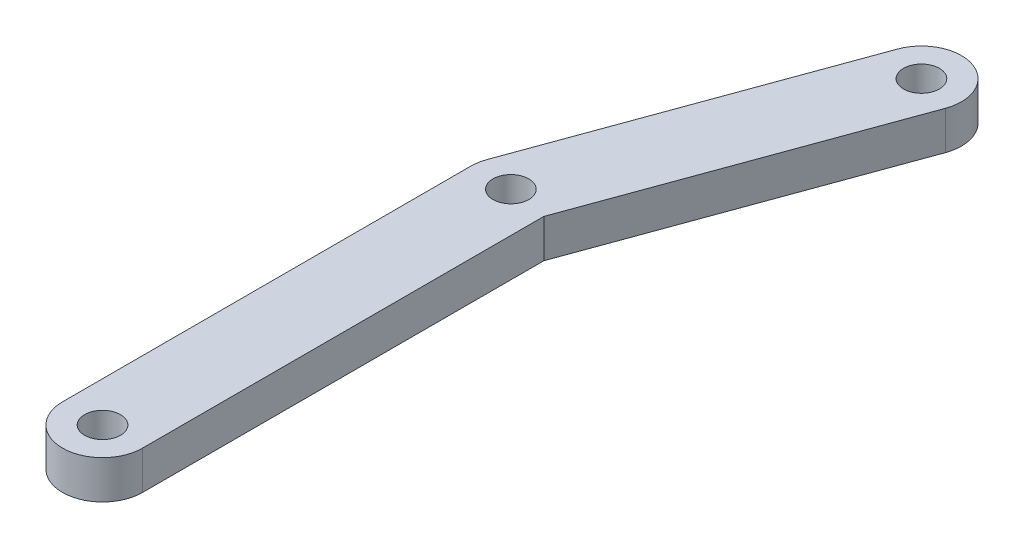
ISO-10303-21;
HEADER;
FILE_DESCRIPTION(('STEP AP214'),'2;1');
FILE_NAME('part.step','',(''),(''),'','','');
FILE_SCHEMA(('AUTOMOTIVE_DESIGN { 1 0 10303 214 1 1 1 1 }'));
ENDSEC;
DATA;
#1=APPLICATION_CONTEXT('core data for automotive mechanical design processes');
#2=APPLICATION_PROTOCOL_DEFINITION('international standard','automotive_design',2000,#1);
#3=PRODUCT_CONTEXT('',#1,'mechanical');
#4=PRODUCT('Part','Part','',(#3));
#5=PRODUCT_RELATED_PRODUCT_CATEGORY('part','',(#4));
#6=PRODUCT_DEFINITION_FORMATION('','',#4);
#7=PRODUCT_DEFINITION_CONTEXT('part definition',#1,'design');
#8=PRODUCT_DEFINITION('design','',#6,#7);
#9=PRODUCT_DEFINITION_SHAPE('','',#8);
#10=(LENGTH_UNIT() NAMED_UNIT(*) SI_UNIT(.MILLI.,.METRE.));
#11=(NAMED_UNIT(*) PLANE_ANGLE_UNIT() SI_UNIT($,.RADIAN.));
#12=(NAMED_UNIT(*) SI_UNIT($,.STERADIAN.) SOLID_ANGLE_UNIT());
#13=UNCERTAINTY_MEASURE_WITH_UNIT(LENGTH_MEASURE(1.E-05),#10,'distance_accuracy_value','');
#14=(GEOMETRIC_REPRESENTATION_CONTEXT(3) GLOBAL_UNCERTAINTY_ASSIGNED_CONTEXT((#13)) GLOBAL_UNIT_ASSIGNED_CONTEXT((#10,
#11,#12)) REPRESENTATION_CONTEXT('',''));
#15=CARTESIAN_POINT('',(0.,0.,0.));
#16=DIRECTION('',(0.,0.,1.));
#17=DIRECTION('',(1.,0.,0.));
#18=AXIS2_PLACEMENT_3D('',#15,#16,#17);
#19=CARTESIAN_POINT('',(-13.3910461005803,3.048,-4.87394218629772));
#20=DIRECTION('',(-0.939692620785908,0.,-0.342020143325669));
#21=DIRECTION('',(-0.342020143325669,0.,0.939692620785908));
#22=AXIS2_PLACEMENT_3D('',#19,#20,#21);
#23=PLANE('',#22);
#24=DIRECTION('',(0.342020143325669,0.,-0.939692620785908));
#25=VECTOR('',#24,1.);
#26=CARTESIAN_POINT('',(-13.3910461005803,0.,-4.87394218629772));
#27=LINE('',#26,#25);
#28=CARTESIAN_POINT('',(-2.98352407099526,0.,-33.468373955059));
#29=VERTEX_POINT('',#28);
#30=CARTESIAN_POINT('',(5.70378756947674,0.,-57.3365665230211));
#31=VERTEX_POINT('',#30);
#32=EDGE_CURVE('E133',#29,#31,#27,.T.);
#33=ORIENTED_EDGE('',*,*,#32,.F.);
#34=DIRECTION('',(0.,-1.,0.));
#35=VECTOR('',#34,1.);
#36=CARTESIAN_POINT('',(-2.98352407099526,3.048,-33.468373955059));
#37=LINE('',#36,#35);
#38=CARTESIAN_POINT('',(-2.98352407099526,3.048,-33.468373955059));
#39=VERTEX_POINT('',#38);
#40=EDGE_CURVE('E11',#39,#29,#37,.T.);
#41=ORIENTED_EDGE('',*,*,#40,.F.);
#42=DIRECTION('',(0.342020143325669,0.,-0.939692620785908));
#43=VECTOR('',#42,1.);
#44=CARTESIAN_POINT('',(-13.3910461005803,3.048,-4.87394218629772));
#45=LINE('',#44,#43);
#46=CARTESIAN_POINT('',(5.70378756947674,3.048,-57.3365665230211));
#47=VERTEX_POINT('',#46);
#48=EDGE_CURVE('E157',#39,#47,#45,.T.);
#49=ORIENTED_EDGE('',*,*,#48,.T.);
#50=DIRECTION('',(0.,-1.,0.));
#51=VECTOR('',#50,1.);
#52=CARTESIAN_POINT('',(5.70378756947674,3.048,-57.3365665230211));
#53=LINE('',#52,#51);
#54=EDGE_CURVE('E83',#47,#31,#53,.T.);
#55=ORIENTED_EDGE('',*,*,#54,.T.);
#56=EDGE_LOOP('',(#33,#41,#49,#55));
#57=FACE_BOUND('',#56,.T.);
#58=ADVANCED_FACE('F35',(#57),#23,.T.);
#59=CARTESIAN_POINT('',(0.,3.048,-32.38246));
#60=DIRECTION('',(0.,-1.,0.));
#61=DIRECTION('',(0.,0.,-1.));
#62=AXIS2_PLACEMENT_3D('',#59,#60,#61);
#63=CYLINDRICAL_SURFACE('',#62,3.175);
#64=CARTESIAN_POINT('',(0.,0.,-32.38246));
#65=DIRECTION('',(0.,1.,0.));
#66=DIRECTION('',(0.,0.,1.));
#67=AXIS2_PLACEMENT_3D('',#64,#65,#66);
#68=CIRCLE('',#67,3.175);
#69=CARTESIAN_POINT('',(-3.175,0.,-32.38246));
#70=VERTEX_POINT('',#69);
#71=EDGE_CURVE('E136',#29,#70,#68,.T.);
#72=ORIENTED_EDGE('',*,*,#71,.T.);
#73=DIRECTION('',(0.,-1.,0.));
#74=VECTOR('',#73,1.);
#75=CARTESIAN_POINT('',(-3.175,3.048,-32.38246));
#76=LINE('',#75,#74);
#77=CARTESIAN_POINT('',(-3.175,3.048,-32.38246));
#78=VERTEX_POINT('',#77);
#79=EDGE_CURVE('E43',#78,#70,#76,.T.);
#80=ORIENTED_EDGE('',*,*,#79,.F.);
#81=CARTESIAN_POINT('',(0.,3.048,-32.38246));
#82=DIRECTION('',(0.,1.,0.));
#83=DIRECTION('',(0.,0.,1.));
#84=AXIS2_PLACEMENT_3D('',#81,#82,#83);
#85=CIRCLE('',#84,3.175);
#86=EDGE_CURVE('E177',#39,#78,#85,.T.);
#87=ORIENTED_EDGE('',*,*,#86,.F.);
#88=ORIENTED_EDGE('',*,*,#40,.T.);
#89=EDGE_LOOP('',(#72,#80,#87,#88));
#90=FACE_BOUND('',#89,.T.);
#91=ADVANCED_FACE('F170',(#90),#63,.T.);
#92=CARTESIAN_POINT('',(-3.175,3.048,0.));
#93=DIRECTION('',(-1.,0.,0.));
#94=DIRECTION('',(0.,0.,1.));
#95=AXIS2_PLACEMENT_3D('',#92,#93,#94);
#96=PLANE('',#95);
#97=DIRECTION('',(0.,0.,-1.));
#98=VECTOR('',#97,1.);
#99=CARTESIAN_POINT('',(-3.175,0.,0.));
#100=LINE('',#99,#98);
#101=CARTESIAN_POINT('',(-3.175,0.,0.));
#102=VERTEX_POINT('',#101);
#103=EDGE_CURVE('E139',#102,#70,#100,.T.);
#104=ORIENTED_EDGE('',*,*,#103,.F.);
#105=DIRECTION('',(0.,-1.,0.));
#106=VECTOR('',#105,1.);
#107=CARTESIAN_POINT('',(-3.175,3.048,0.));
#108=LINE('',#107,#106);
#109=CARTESIAN_POINT('',(-3.175,3.048,0.));
#110=VERTEX_POINT('',#109);
#111=EDGE_CURVE('E161',#110,#102,#108,.T.);
#112=ORIENTED_EDGE('',*,*,#111,.F.);
#113=DIRECTION('',(0.,0.,-1.));
#114=VECTOR('',#113,1.);
#115=CARTESIAN_POINT('',(-3.175,3.048,0.));
#116=LINE('',#115,#114);
#117=EDGE_CURVE('E167',#110,#78,#116,.T.);
#118=ORIENTED_EDGE('',*,*,#117,.T.);
#119=ORIENTED_EDGE('',*,*,#79,.T.);
#120=EDGE_LOOP('',(#104,#112,#118,#119));
#121=FACE_BOUND('',#120,.T.);
#122=ADVANCED_FACE('F166',(#121),#96,.T.);
#123=CARTESIAN_POINT('',(0.,3.048,0.));
#124=DIRECTION('',(0.,-1.,0.));
#125=DIRECTION('',(0.,0.,-1.));
#126=AXIS2_PLACEMENT_3D('',#123,#124,#125);
#127=CYLINDRICAL_SURFACE('',#126,3.175);
#128=CARTESIAN_POINT('',(0.,0.,0.));
#129=DIRECTION('',(0.,1.,0.));
#130=DIRECTION('',(0.,0.,1.));
#131=AXIS2_PLACEMENT_3D('',#128,#129,#130);
#132=CIRCLE('',#131,3.175);
#133=CARTESIAN_POINT('',(3.175,0.,0.));
#134=VERTEX_POINT('',#133);
#135=EDGE_CURVE('E142',#102,#134,#132,.T.);
#136=ORIENTED_EDGE('',*,*,#135,.T.);
#137=DIRECTION('',(0.,-1.,0.));
#138=VECTOR('',#137,1.);
#139=CARTESIAN_POINT('',(3.175,3.048,0.));
#140=LINE('',#139,#138);
#141=CARTESIAN_POINT('',(3.175,3.048,0.));
#142=VERTEX_POINT('',#141);
#143=EDGE_CURVE('E116',#142,#134,#140,.T.);
#144=ORIENTED_EDGE('',*,*,#143,.F.);
#145=CARTESIAN_POINT('',(0.,3.048,0.));
#146=DIRECTION('',(0.,1.,0.));
#147=DIRECTION('',(0.,0.,1.));
#148=AXIS2_PLACEMENT_3D('',#145,#146,#147);
#149=CIRCLE('',#148,3.175);
#150=EDGE_CURVE('E107',#110,#142,#149,.T.);
#151=ORIENTED_EDGE('',*,*,#150,.F.);
#152=ORIENTED_EDGE('',*,*,#111,.T.);
#153=EDGE_LOOP('',(#136,#144,#151,#152));
#154=FACE_BOUND('',#153,.T.);
#155=ADVANCED_FACE('F176',(#154),#127,.T.);
#156=CARTESIAN_POINT('',(3.175,3.048,0.));
#157=DIRECTION('',(-1.,0.,0.));
#158=DIRECTION('',(0.,0.,1.));
#159=AXIS2_PLACEMENT_3D('',#156,#157,#158);
#160=PLANE('',#159);
#161=DIRECTION('',(0.,0.,-1.));
#162=VECTOR('',#161,1.);
#163=CARTESIAN_POINT('',(3.175,0.,0.));
#164=LINE('',#163,#162);
#165=CARTESIAN_POINT('',(3.175,0.,-31.8226218362506));
#166=VERTEX_POINT('',#165);
#167=EDGE_CURVE('E115',#134,#166,#164,.T.);
#168=ORIENTED_EDGE('',*,*,#167,.T.);
#169=DIRECTION('',(0.,-1.,0.));
#170=VECTOR('',#169,1.);
#171=CARTESIAN_POINT('',(3.175,3.048,-31.8226218362506));
#172=LINE('',#171,#170);
#173=CARTESIAN_POINT('',(3.175,3.048,-31.8226218362506));
#174=VERTEX_POINT('',#173);
#175=EDGE_CURVE('E112',#174,#166,#172,.T.);
#176=ORIENTED_EDGE('',*,*,#175,.F.);
#177=DIRECTION('',(0.,0.,-1.));
#178=VECTOR('',#177,1.);
#179=CARTESIAN_POINT('',(3.175,3.048,0.));
#180=LINE('',#179,#178);
#181=EDGE_CURVE('E99',#142,#174,#180,.T.);
#182=ORIENTED_EDGE('',*,*,#181,.F.);
#183=ORIENTED_EDGE('',*,*,#143,.T.);
#184=EDGE_LOOP('',(#168,#176,#182,#183));
#185=FACE_BOUND('',#184,.T.);
#186=ADVANCED_FACE('F113',(#185),#160,.F.);
#187=CARTESIAN_POINT('',(-7.42399795858973,3.048,-2.70211427617972));
#188=DIRECTION('',(-0.939692620785908,0.,-0.342020143325669));
#189=DIRECTION('',(-0.342020143325669,0.,0.939692620785908));
#190=AXIS2_PLACEMENT_3D('',#187,#188,#189);
#191=PLANE('',#190);
#192=DIRECTION('',(0.342020143325669,0.,-0.939692620785908));
#193=VECTOR('',#192,1.);
#194=CARTESIAN_POINT('',(-7.42399795858973,0.,-2.70211427617972));
#195=LINE('',#194,#193);
#196=CARTESIAN_POINT('',(11.6708357114673,0.,-55.1647386129031));
#197=VERTEX_POINT('',#196);
#198=EDGE_CURVE('E76',#166,#197,#195,.T.);
#199=ORIENTED_EDGE('',*,*,#198,.T.);
#200=DIRECTION('',(0.,-1.,0.));
#201=VECTOR('',#200,1.);
#202=CARTESIAN_POINT('',(11.6708357114673,3.048,-55.1647386129031));
#203=LINE('',#202,#201);
#204=CARTESIAN_POINT('',(11.6708357114673,3.048,-55.1647386129031));
#205=VERTEX_POINT('',#204);
#206=EDGE_CURVE('E117',#205,#197,#203,.T.);
#207=ORIENTED_EDGE('',*,*,#206,.F.);
#208=DIRECTION('',(0.342020143325669,0.,-0.939692620785908));
#209=VECTOR('',#208,1.);
#210=CARTESIAN_POINT('',(-7.42399795858973,3.048,-2.70211427617972));
#211=LINE('',#210,#209);
#212=EDGE_CURVE('E104',#174,#205,#211,.T.);
#213=ORIENTED_EDGE('',*,*,#212,.F.);
#214=ORIENTED_EDGE('',*,*,#175,.T.);
#215=EDGE_LOOP('',(#199,#207,#213,#214));
#216=FACE_BOUND('',#215,.T.);
#217=ADVANCED_FACE('F119',(#216),#191,.F.);
#218=CARTESIAN_POINT('',(0.,3.048,-32.38246));
#219=DIRECTION('',(0.,-1.,0.));
#220=DIRECTION('',(0.,0.,-1.));
#221=AXIS2_PLACEMENT_3D('',#218,#219,#220);
#222=CYLINDRICAL_SURFACE('',#221,1.4224);
#223=CARTESIAN_POINT('',(0.,3.048,-32.38246));
#224=DIRECTION('',(0.,1.,0.));
#225=DIRECTION('',(0.,0.,1.));
#226=AXIS2_PLACEMENT_3D('',#223,#224,#225);
#227=CIRCLE('',#226,1.4224);
#228=CARTESIAN_POINT('',(0.,3.048,-33.80486));
#229=VERTEX_POINT('',#228);
#230=EDGE_CURVE('E127',#229,#229,#227,.T.);
#231=CARTESIAN_POINT('',(0.,0.,-32.38246));
#232=DIRECTION('',(0.,1.,0.));
#233=DIRECTION('',(0.,0.,1.));
#234=AXIS2_PLACEMENT_3D('',#231,#232,#233);
#235=CIRCLE('',#234,1.4224);
#236=CARTESIAN_POINT('',(0.,0.,-33.80486));
#237=VERTEX_POINT('',#236);
#238=EDGE_CURVE('E151',#237,#237,#235,.T.);
#239=CARTESIAN_POINT('',(0.,3.048,-33.80486));
#240=CARTESIAN_POINT('',(0.,3.01625,-33.80486));
#241=CARTESIAN_POINT('',(0.,2.9845,-33.80486));
#242=CARTESIAN_POINT('',(0.,2.921,-33.80486));
#243=CARTESIAN_POINT('',(0.,2.88925,-33.80486));
#244=CARTESIAN_POINT('',(0.,2.82575,-33.80486));
#245=CARTESIAN_POINT('',(0.,2.794,-33.80486));
#246=CARTESIAN_POINT('',(0.,2.7305,-33.80486));
#247=CARTESIAN_POINT('',(0.,2.69875,-33.80486));
#248=CARTESIAN_POINT('',(0.,2.63525,-33.80486));
#249=CARTESIAN_POINT('',(0.,2.6035,-33.80486));
#250=CARTESIAN_POINT('',(0.,2.54,-33.80486));
#251=CARTESIAN_POINT('',(0.,2.50825,-33.80486));
#252=CARTESIAN_POINT('',(0.,2.44475,-33.80486));
#253=CARTESIAN_POINT('',(0.,2.413,-33.80486));
#254=CARTESIAN_POINT('',(0.,2.3495,-33.80486));
#255=CARTESIAN_POINT('',(0.,2.31775,-33.80486));
#256=CARTESIAN_POINT('',(0.,2.25425,-33.80486));
#257=CARTESIAN_POINT('',(0.,2.2225,-33.80486));
#258=CARTESIAN_POINT('',(0.,2.159,-33.80486));
#259=CARTESIAN_POINT('',(0.,2.12725,-33.80486));
#260=CARTESIAN_POINT('',(0.,2.06375,-33.80486));
#261=CARTESIAN_POINT('',(0.,2.032,-33.80486));
#262=CARTESIAN_POINT('',(0.,1.9685,-33.80486));
#263=CARTESIAN_POINT('',(0.,1.93675,-33.80486));
#264=CARTESIAN_POINT('',(0.,1.87325,-33.80486));
#265=CARTESIAN_POINT('',(0.,1.8415,-33.80486));
#266=CARTESIAN_POINT('',(0.,1.778,-33.80486));
#267=CARTESIAN_POINT('',(0.,1.74625,-33.80486));
#268=CARTESIAN_POINT('',(0.,1.68275,-33.80486));
#269=CARTESIAN_POINT('',(0.,1.651,-33.80486));
#270=CARTESIAN_POINT('',(0.,1.5875,-33.80486));
#271=CARTESIAN_POINT('',(0.,1.55575,-33.80486));
#272=CARTESIAN_POINT('',(0.,1.49225,-33.80486));
#273=CARTESIAN_POINT('',(0.,1.4605,-33.80486));
#274=CARTESIAN_POINT('',(0.,1.397,-33.80486));
#275=CARTESIAN_POINT('',(0.,1.36525,-33.80486));
#276=CARTESIAN_POINT('',(0.,1.30175,-33.80486));
#277=CARTESIAN_POINT('',(0.,1.27,-33.80486));
#278=CARTESIAN_POINT('',(0.,1.2065,-33.80486));
#279=CARTESIAN_POINT('',(0.,1.17475,-33.80486));
#280=CARTESIAN_POINT('',(0.,1.11125,-33.80486));
#281=CARTESIAN_POINT('',(0.,1.0795,-33.80486));
#282=CARTESIAN_POINT('',(0.,1.016,-33.80486));
#283=CARTESIAN_POINT('',(0.,0.98425,-33.80486));
#284=CARTESIAN_POINT('',(0.,0.92075,-33.80486));
#285=CARTESIAN_POINT('',(0.,0.889,-33.80486));
#286=CARTESIAN_POINT('',(0.,0.8255,-33.80486));
#287=CARTESIAN_POINT('',(0.,0.79375,-33.80486));
#288=CARTESIAN_POINT('',(0.,0.73025,-33.80486));
#289=CARTESIAN_POINT('',(0.,0.6985,-33.80486));
#290=CARTESIAN_POINT('',(0.,0.635,-33.80486));
#291=CARTESIAN_POINT('',(0.,0.60325,-33.80486));
#292=CARTESIAN_POINT('',(0.,0.53975,-33.80486));
#293=CARTESIAN_POINT('',(0.,0.508,-33.80486));
#294=CARTESIAN_POINT('',(0.,0.4445,-33.80486));
#295=CARTESIAN_POINT('',(0.,0.41275,-33.80486));
#296=CARTESIAN_POINT('',(0.,0.34925,-33.80486));
#297=CARTESIAN_POINT('',(0.,0.3175,-33.80486));
#298=CARTESIAN_POINT('',(0.,0.254,-33.80486));
#299=CARTESIAN_POINT('',(0.,0.22225,-33.80486));
#300=CARTESIAN_POINT('',(0.,0.15875,-33.80486));
#301=CARTESIAN_POINT('',(0.,0.127,-33.80486));
#302=CARTESIAN_POINT('',(0.,0.0634999999999999,-33.80486));
#303=CARTESIAN_POINT('',(0.,0.03175,-33.80486));
#304=CARTESIAN_POINT('',(0.,0.,-33.80486));
#305=B_SPLINE_CURVE_WITH_KNOTS('',3,(#239,#240,#241,#242,#243,#244,#245,#246,#247,#248,#249,
#250,#251,#252,#253,#254,#255,#256,#257,#258,#259,#260,#261,#262,#263,#264,#265,#266,#267,#268,
#269,#270,#271,#272,#273,#274,#275,#276,#277,#278,#279,#280,#281,#282,#283,#284,#285,#286,#287,
#288,#289,#290,#291,#292,#293,#294,#295,#296,#297,#298,#299,#300,#301,#302,#303,#304),
.UNSPECIFIED.,.F.,.F.,(4,2,2,2,2,2,2,2,2,2,2,2,2,2,2,2,2,2,2,2,2,2,2,2,2,2,2,2,2,2,2,2,4),(0.,
0.0952499999999998,0.1905,0.28575,0.381,0.47625,0.5715,0.66675,0.762,0.85725,0.9525,1.04775,
1.143,1.23825,1.3335,1.42875,1.524,1.61925,1.7145,1.80975,1.905,2.00025,2.0955,2.19075,2.286,
2.38125,2.4765,2.57175,2.667,2.76225,2.8575,2.95275,3.048),.UNSPECIFIED.);
#306=EDGE_CURVE('BSEAM196',#229,#237,#305,.T.);
#307=ORIENTED_EDGE('',*,*,#230,.T.);
#308=ORIENTED_EDGE('',*,*,#238,.F.);
#309=ORIENTED_EDGE('',*,*,#306,.T.);
#310=ORIENTED_EDGE('',*,*,#306,.F.);
#311=EDGE_LOOP('',(#307,#309,#308,#310));
#312=FACE_BOUND('',#311,.T.);
#313=ADVANCED_FACE('F196',(#312),#222,.F.);
#314=CARTESIAN_POINT('',(8.687311640472,3.048,-56.2506525679621));
#315=DIRECTION('',(0.,-1.,0.));
#316=DIRECTION('',(0.,0.,-1.));
#317=AXIS2_PLACEMENT_3D('',#314,#315,#316);
#318=CYLINDRICAL_SURFACE('',#317,1.4224);
#319=CARTESIAN_POINT('',(8.687311640472,3.048,-56.2506525679621));
#320=DIRECTION('',(0.,1.,0.));
#321=DIRECTION('',(0.,0.,1.));
#322=AXIS2_PLACEMENT_3D('',#319,#320,#321);
#323=CIRCLE('',#322,1.4224);
#324=CARTESIAN_POINT('',(8.687311640472,3.048,-57.6730525679621));
#325=VERTEX_POINT('',#324);
#326=EDGE_CURVE('E121',#325,#325,#323,.T.);
#327=CARTESIAN_POINT('',(8.687311640472,0.,-56.2506525679621));
#328=DIRECTION('',(0.,1.,0.));
#329=DIRECTION('',(0.,0.,1.));
#330=AXIS2_PLACEMENT_3D('',#327,#328,#329);
#331=CIRCLE('',#330,1.4224);
#332=CARTESIAN_POINT('',(8.687311640472,0.,-57.6730525679621));
#333=VERTEX_POINT('',#332);
#334=EDGE_CURVE('E148',#333,#333,#331,.T.);
#335=CARTESIAN_POINT('',(8.687311640472,3.048,-57.6730525679621));
#336=CARTESIAN_POINT('',(8.687311640472,3.01625,-57.6730525679621));
#337=CARTESIAN_POINT('',(8.687311640472,2.9845,-57.6730525679621));
#338=CARTESIAN_POINT('',(8.687311640472,2.921,-57.6730525679621));
#339=CARTESIAN_POINT('',(8.687311640472,2.88925,-57.6730525679621));
#340=CARTESIAN_POINT('',(8.687311640472,2.82575,-57.6730525679621));
#341=CARTESIAN_POINT('',(8.687311640472,2.794,-57.6730525679621));
#342=CARTESIAN_POINT('',(8.687311640472,2.7305,-57.6730525679621));
#343=CARTESIAN_POINT('',(8.687311640472,2.69875,-57.6730525679621));
#344=CARTESIAN_POINT('',(8.687311640472,2.63525,-57.6730525679621));
#345=CARTESIAN_POINT('',(8.687311640472,2.6035,-57.6730525679621));
#346=CARTESIAN_POINT('',(8.687311640472,2.54,-57.6730525679621));
#347=CARTESIAN_POINT('',(8.687311640472,2.50825,-57.6730525679621));
#348=CARTESIAN_POINT('',(8.687311640472,2.44475,-57.6730525679621));
#349=CARTESIAN_POINT('',(8.687311640472,2.413,-57.6730525679621));
#350=CARTESIAN_POINT('',(8.687311640472,2.3495,-57.6730525679621));
#351=CARTESIAN_POINT('',(8.687311640472,2.31775,-57.6730525679621));
#352=CARTESIAN_POINT('',(8.687311640472,2.25425,-57.6730525679621));
#353=CARTESIAN_POINT('',(8.687311640472,2.2225,-57.6730525679621));
#354=CARTESIAN_POINT('',(8.687311640472,2.159,-57.6730525679621));
#355=CARTESIAN_POINT('',(8.687311640472,2.12725,-57.6730525679621));
#356=CARTESIAN_POINT('',(8.687311640472,2.06375,-57.6730525679621));
#357=CARTESIAN_POINT('',(8.687311640472,2.032,-57.6730525679621));
#358=CARTESIAN_POINT('',(8.687311640472,1.9685,-57.6730525679621));
#359=CARTESIAN_POINT('',(8.687311640472,1.93675,-57.6730525679621));
#360=CARTESIAN_POINT('',(8.687311640472,1.87325,-57.6730525679621));
#361=CARTESIAN_POINT('',(8.687311640472,1.8415,-57.6730525679621));
#362=CARTESIAN_POINT('',(8.687311640472,1.778,-57.6730525679621));
#363=CARTESIAN_POINT('',(8.687311640472,1.74625,-57.6730525679621));
#364=CARTESIAN_POINT('',(8.687311640472,1.68275,-57.6730525679621));
#365=CARTESIAN_POINT('',(8.687311640472,1.651,-57.6730525679621));
#366=CARTESIAN_POINT('',(8.687311640472,1.5875,-57.6730525679621));
#367=CARTESIAN_POINT('',(8.687311640472,1.55575,-57.6730525679621));
#368=CARTESIAN_POINT('',(8.687311640472,1.49225,-57.6730525679621));
#369=CARTESIAN_POINT('',(8.687311640472,1.4605,-57.6730525679621));
#370=CARTESIAN_POINT('',(8.687311640472,1.397,-57.6730525679621));
#371=CARTESIAN_POINT('',(8.687311640472,1.36525,-57.6730525679621));
#372=CARTESIAN_POINT('',(8.687311640472,1.30175,-57.6730525679621));
#373=CARTESIAN_POINT('',(8.687311640472,1.27,-57.6730525679621));
#374=CARTESIAN_POINT('',(8.687311640472,1.2065,-57.6730525679621));
#375=CARTESIAN_POINT('',(8.687311640472,1.17475,-57.6730525679621));
#376=CARTESIAN_POINT('',(8.687311640472,1.11125,-57.6730525679621));
#377=CARTESIAN_POINT('',(8.687311640472,1.0795,-57.6730525679621));
#378=CARTESIAN_POINT('',(8.687311640472,1.016,-57.6730525679621));
#379=CARTESIAN_POINT('',(8.687311640472,0.98425,-57.6730525679621));
#380=CARTESIAN_POINT('',(8.687311640472,0.92075,-57.6730525679621));
#381=CARTESIAN_POINT('',(8.687311640472,0.889,-57.6730525679621));
#382=CARTESIAN_POINT('',(8.687311640472,0.8255,-57.6730525679621));
#383=CARTESIAN_POINT('',(8.687311640472,0.79375,-57.6730525679621));
#384=CARTESIAN_POINT('',(8.687311640472,0.73025,-57.6730525679621));
#385=CARTESIAN_POINT('',(8.687311640472,0.6985,-57.6730525679621));
#386=CARTESIAN_POINT('',(8.687311640472,0.635,-57.6730525679621));
#387=CARTESIAN_POINT('',(8.687311640472,0.60325,-57.6730525679621));
#388=CARTESIAN_POINT('',(8.687311640472,0.53975,-57.6730525679621));
#389=CARTESIAN_POINT('',(8.687311640472,0.508,-57.6730525679621));
#390=CARTESIAN_POINT('',(8.687311640472,0.4445,-57.6730525679621));
#391=CARTESIAN_POINT('',(8.687311640472,0.41275,-57.6730525679621));
#392=CARTESIAN_POINT('',(8.687311640472,0.34925,-57.6730525679621));
#393=CARTESIAN_POINT('',(8.687311640472,0.3175,-57.6730525679621));
#394=CARTESIAN_POINT('',(8.687311640472,0.254,-57.6730525679621));
#395=CARTESIAN_POINT('',(8.687311640472,0.22225,-57.6730525679621));
#396=CARTESIAN_POINT('',(8.687311640472,0.15875,-57.6730525679621));
#397=CARTESIAN_POINT('',(8.687311640472,0.127,-57.6730525679621));
#398=CARTESIAN_POINT('',(8.687311640472,0.0634999999999999,-57.6730525679621));
#399=CARTESIAN_POINT('',(8.687311640472,0.03175,-57.6730525679621));
#400=CARTESIAN_POINT('',(8.687311640472,0.,-57.6730525679621));
#401=B_SPLINE_CURVE_WITH_KNOTS('',3,(#335,#336,#337,#338,#339,#340,#341,#342,#343,#344,#345,
#346,#347,#348,#349,#350,#351,#352,#353,#354,#355,#356,#357,#358,#359,#360,#361,#362,#363,#364,
#365,#366,#367,#368,#369,#370,#371,#372,#373,#374,#375,#376,#377,#378,#379,#380,#381,#382,#383,
#384,#385,#386,#387,#388,#389,#390,#391,#392,#393,#394,#395,#396,#397,#398,#399,#400),
.UNSPECIFIED.,.F.,.F.,(4,2,2,2,2,2,2,2,2,2,2,2,2,2,2,2,2,2,2,2,2,2,2,2,2,2,2,2,2,2,2,2,4),(0.,
0.0952499999999998,0.1905,0.28575,0.381,0.47625,0.5715,0.66675,0.762,0.85725,0.9525,1.04775,
1.143,1.23825,1.3335,1.42875,1.524,1.61925,1.7145,1.80975,1.905,2.00025,2.0955,2.19075,2.286,
2.38125,2.4765,2.57175,2.667,2.76225,2.8575,2.95275,3.048),.UNSPECIFIED.);
#402=EDGE_CURVE('BSEAM201',#325,#333,#401,.T.);
#403=ORIENTED_EDGE('',*,*,#326,.T.);
#404=ORIENTED_EDGE('',*,*,#334,.F.);
#405=ORIENTED_EDGE('',*,*,#402,.T.);
#406=ORIENTED_EDGE('',*,*,#402,.F.);
#407=EDGE_LOOP('',(#403,#405,#404,#406));
#408=FACE_BOUND('',#407,.T.);
#409=ADVANCED_FACE('F201',(#408),#318,.F.);
#410=CARTESIAN_POINT('',(8.687311640472,3.048,-56.2506525679621));
#411=DIRECTION('',(0.,-1.,0.));
#412=DIRECTION('',(0.,0.,-1.));
#413=AXIS2_PLACEMENT_3D('',#410,#411,#412);
#414=CYLINDRICAL_SURFACE('',#413,3.175);
#415=CARTESIAN_POINT('',(8.687311640472,0.,-56.2506525679621));
#416=DIRECTION('',(0.,1.,0.));
#417=DIRECTION('',(0.,0.,1.));
#418=AXIS2_PLACEMENT_3D('',#415,#416,#417);
#419=CIRCLE('',#418,3.175);
#420=EDGE_CURVE('E146',#197,#31,#419,.T.);
#421=ORIENTED_EDGE('',*,*,#420,.T.);
#422=ORIENTED_EDGE('',*,*,#54,.F.);
#423=CARTESIAN_POINT('',(8.687311640472,3.048,-56.2506525679621));
#424=DIRECTION('',(0.,1.,0.));
#425=DIRECTION('',(0.,0.,1.));
#426=AXIS2_PLACEMENT_3D('',#423,#424,#425);
#427=CIRCLE('',#426,3.175);
#428=EDGE_CURVE('E51',#205,#47,#427,.T.);
#429=ORIENTED_EDGE('',*,*,#428,.F.);
#430=ORIENTED_EDGE('',*,*,#206,.T.);
#431=EDGE_LOOP('',(#421,#422,#429,#430));
#432=FACE_BOUND('',#431,.T.);
#433=ADVANCED_FACE('F197',(#432),#414,.T.);
#434=CARTESIAN_POINT('',(0.,3.048,0.));
#435=DIRECTION('',(0.,-1.,0.));
#436=DIRECTION('',(0.,0.,-1.));
#437=AXIS2_PLACEMENT_3D('',#434,#435,#436);
#438=CYLINDRICAL_SURFACE('',#437,1.4224);
#439=CARTESIAN_POINT('',(0.,3.048,0.));
#440=DIRECTION('',(0.,1.,0.));
#441=DIRECTION('',(0.,0.,1.));
#442=AXIS2_PLACEMENT_3D('',#439,#440,#441);
#443=CIRCLE('',#442,1.4224);
#444=CARTESIAN_POINT('',(0.,3.048,-1.4224));
#445=VERTEX_POINT('',#444);
#446=EDGE_CURVE('E130',#445,#445,#443,.T.);
#447=CARTESIAN_POINT('',(0.,0.,0.));
#448=DIRECTION('',(0.,1.,0.));
#449=DIRECTION('',(0.,0.,1.));
#450=AXIS2_PLACEMENT_3D('',#447,#448,#449);
#451=CIRCLE('',#450,1.4224);
#452=CARTESIAN_POINT('',(0.,0.,-1.4224));
#453=VERTEX_POINT('',#452);
#454=EDGE_CURVE('E154',#453,#453,#451,.T.);
#455=CARTESIAN_POINT('',(0.,3.048,-1.4224));
#456=CARTESIAN_POINT('',(0.,3.01625,-1.4224));
#457=CARTESIAN_POINT('',(0.,2.9845,-1.4224));
#458=CARTESIAN_POINT('',(0.,2.921,-1.4224));
#459=CARTESIAN_POINT('',(0.,2.88925,-1.4224));
#460=CARTESIAN_POINT('',(0.,2.82575,-1.4224));
#461=CARTESIAN_POINT('',(0.,2.794,-1.4224));
#462=CARTESIAN_POINT('',(0.,2.7305,-1.4224));
#463=CARTESIAN_POINT('',(0.,2.69875,-1.4224));
#464=CARTESIAN_POINT('',(0.,2.63525,-1.4224));
#465=CARTESIAN_POINT('',(0.,2.6035,-1.4224));
#466=CARTESIAN_POINT('',(0.,2.54,-1.4224));
#467=CARTESIAN_POINT('',(0.,2.50825,-1.4224));
#468=CARTESIAN_POINT('',(0.,2.44475,-1.4224));
#469=CARTESIAN_POINT('',(0.,2.413,-1.4224));
#470=CARTESIAN_POINT('',(0.,2.3495,-1.4224));
#471=CARTESIAN_POINT('',(0.,2.31775,-1.4224));
#472=CARTESIAN_POINT('',(0.,2.25425,-1.4224));
#473=CARTESIAN_POINT('',(0.,2.2225,-1.4224));
#474=CARTESIAN_POINT('',(0.,2.159,-1.4224));
#475=CARTESIAN_POINT('',(0.,2.12725,-1.4224));
#476=CARTESIAN_POINT('',(0.,2.06375,-1.4224));
#477=CARTESIAN_POINT('',(0.,2.032,-1.4224));
#478=CARTESIAN_POINT('',(0.,1.9685,-1.4224));
#479=CARTESIAN_POINT('',(0.,1.93675,-1.4224));
#480=CARTESIAN_POINT('',(0.,1.87325,-1.4224));
#481=CARTESIAN_POINT('',(0.,1.8415,-1.4224));
#482=CARTESIAN_POINT('',(0.,1.778,-1.4224));
#483=CARTESIAN_POINT('',(0.,1.74625,-1.4224));
#484=CARTESIAN_POINT('',(0.,1.68275,-1.4224));
#485=CARTESIAN_POINT('',(0.,1.651,-1.4224));
#486=CARTESIAN_POINT('',(0.,1.5875,-1.4224));
#487=CARTESIAN_POINT('',(0.,1.55575,-1.4224));
#488=CARTESIAN_POINT('',(0.,1.49225,-1.4224));
#489=CARTESIAN_POINT('',(0.,1.4605,-1.4224));
#490=CARTESIAN_POINT('',(0.,1.397,-1.4224));
#491=CARTESIAN_POINT('',(0.,1.36525,-1.4224));
#492=CARTESIAN_POINT('',(0.,1.30175,-1.4224));
#493=CARTESIAN_POINT('',(0.,1.27,-1.4224));
#494=CARTESIAN_POINT('',(0.,1.2065,-1.4224));
#495=CARTESIAN_POINT('',(0.,1.17475,-1.4224));
#496=CARTESIAN_POINT('',(0.,1.11125,-1.4224));
#497=CARTESIAN_POINT('',(0.,1.0795,-1.4224));
#498=CARTESIAN_POINT('',(0.,1.016,-1.4224));
#499=CARTESIAN_POINT('',(0.,0.98425,-1.4224));
#500=CARTESIAN_POINT('',(0.,0.92075,-1.4224));
#501=CARTESIAN_POINT('',(0.,0.889,-1.4224));
#502=CARTESIAN_POINT('',(0.,0.8255,-1.4224));
#503=CARTESIAN_POINT('',(0.,0.79375,-1.4224));
#504=CARTESIAN_POINT('',(0.,0.73025,-1.4224));
#505=CARTESIAN_POINT('',(0.,0.6985,-1.4224));
#506=CARTESIAN_POINT('',(0.,0.635,-1.4224));
#507=CARTESIAN_POINT('',(0.,0.60325,-1.4224));
#508=CARTESIAN_POINT('',(0.,0.53975,-1.4224));
#509=CARTESIAN_POINT('',(0.,0.508,-1.4224));
#510=CARTESIAN_POINT('',(0.,0.4445,-1.4224));
#511=CARTESIAN_POINT('',(0.,0.41275,-1.4224));
#512=CARTESIAN_POINT('',(0.,0.34925,-1.4224));
#513=CARTESIAN_POINT('',(0.,0.3175,-1.4224));
#514=CARTESIAN_POINT('',(0.,0.254,-1.4224));
#515=CARTESIAN_POINT('',(0.,0.22225,-1.4224));
#516=CARTESIAN_POINT('',(0.,0.15875,-1.4224));
#517=CARTESIAN_POINT('',(0.,0.127,-1.4224));
#518=CARTESIAN_POINT('',(0.,0.0634999999999999,-1.4224));
#519=CARTESIAN_POINT('',(0.,0.03175,-1.4224));
#520=CARTESIAN_POINT('',(0.,0.,-1.4224));
#521=B_SPLINE_CURVE_WITH_KNOTS('',3,(#455,#456,#457,#458,#459,#460,#461,#462,#463,#464,#465,
#466,#467,#468,#469,#470,#471,#472,#473,#474,#475,#476,#477,#478,#479,#480,#481,#482,#483,#484,
#485,#486,#487,#488,#489,#490,#491,#492,#493,#494,#495,#496,#497,#498,#499,#500,#501,#502,#503,
#504,#505,#506,#507,#508,#509,#510,#511,#512,#513,#514,#515,#516,#517,#518,#519,#520),
.UNSPECIFIED.,.F.,.F.,(4,2,2,2,2,2,2,2,2,2,2,2,2,2,2,2,2,2,2,2,2,2,2,2,2,2,2,2,2,2,2,2,4),(0.,
0.0952499999999998,0.1905,0.28575,0.381,0.47625,0.5715,0.66675,0.762,0.85725,0.9525,1.04775,
1.143,1.23825,1.3335,1.42875,1.524,1.61925,1.7145,1.80975,1.905,2.00025,2.0955,2.19075,2.286,
2.38125,2.4765,2.57175,2.667,2.76225,2.8575,2.95275,3.048),.UNSPECIFIED.);
#522=EDGE_CURVE('BSEAM200',#445,#453,#521,.T.);
#523=ORIENTED_EDGE('',*,*,#446,.T.);
#524=ORIENTED_EDGE('',*,*,#454,.F.);
#525=ORIENTED_EDGE('',*,*,#522,.T.);
#526=ORIENTED_EDGE('',*,*,#522,.F.);
#527=EDGE_LOOP('',(#523,#525,#524,#526));
#528=FACE_BOUND('',#527,.T.);
#529=ADVANCED_FACE('F200',(#528),#438,.F.);
#530=CARTESIAN_POINT('',(0.,3.048,0.));
#531=DIRECTION('',(0.,1.,0.));
#532=DIRECTION('',(0.,0.,1.));
#533=AXIS2_PLACEMENT_3D('',#530,#531,#532);
#534=PLANE('',#533);
#535=ORIENTED_EDGE('',*,*,#48,.F.);
#536=ORIENTED_EDGE('',*,*,#86,.T.);
#537=ORIENTED_EDGE('',*,*,#117,.F.);
#538=ORIENTED_EDGE('',*,*,#150,.T.);
#539=ORIENTED_EDGE('',*,*,#181,.T.);
#540=ORIENTED_EDGE('',*,*,#212,.T.);
#541=ORIENTED_EDGE('',*,*,#428,.T.);
#542=EDGE_LOOP('',(#535,#536,#537,#538,#539,#540,#541));
#543=FACE_BOUND('',#542,.T.);
#544=ORIENTED_EDGE('',*,*,#326,.F.);
#545=EDGE_LOOP('',(#544));
#546=FACE_BOUND('',#545,.T.);
#547=ORIENTED_EDGE('',*,*,#230,.F.);
#548=EDGE_LOOP('',(#547));
#549=FACE_BOUND('',#548,.T.);
#550=ORIENTED_EDGE('',*,*,#446,.F.);
#551=EDGE_LOOP('',(#550));
#552=FACE_BOUND('',#551,.T.);
#553=ADVANCED_FACE('F101',(#543,#546,#549,#552),#534,.T.);
#554=CARTESIAN_POINT('',(0.,0.,0.));
#555=DIRECTION('',(0.,1.,0.));
#556=DIRECTION('',(0.,0.,1.));
#557=AXIS2_PLACEMENT_3D('',#554,#555,#556);
#558=PLANE('',#557);
#559=ORIENTED_EDGE('',*,*,#32,.T.);
#560=ORIENTED_EDGE('',*,*,#420,.F.);
#561=ORIENTED_EDGE('',*,*,#198,.F.);
#562=ORIENTED_EDGE('',*,*,#167,.F.);
#563=ORIENTED_EDGE('',*,*,#135,.F.);
#564=ORIENTED_EDGE('',*,*,#103,.T.);
#565=ORIENTED_EDGE('',*,*,#71,.F.);
#566=EDGE_LOOP('',(#559,#560,#561,#562,#563,#564,#565));
#567=FACE_BOUND('',#566,.T.);
#568=ORIENTED_EDGE('',*,*,#334,.T.);
#569=EDGE_LOOP('',(#568));
#570=FACE_BOUND('',#569,.T.);
#571=ORIENTED_EDGE('',*,*,#238,.T.);
#572=EDGE_LOOP('',(#571));
#573=FACE_BOUND('',#572,.T.);
#574=ORIENTED_EDGE('',*,*,#454,.T.);
#575=EDGE_LOOP('',(#574));
#576=FACE_BOUND('',#575,.T.);
#577=ADVANCED_FACE('F173',(#567,#570,#573,#576),#558,.F.);
#578=CLOSED_SHELL('',(#58,#91,#122,#155,#186,#217,#313,#409,#433,#529,#553,#577));
#579=MANIFOLD_SOLID_BREP('B2',#578);
#580=ADVANCED_BREP_SHAPE_REPRESENTATION('',(#18,#579),#14);
#581=SHAPE_DEFINITION_REPRESENTATION(#9,#580);
ENDSEC;
END-ISO-10303-21;
